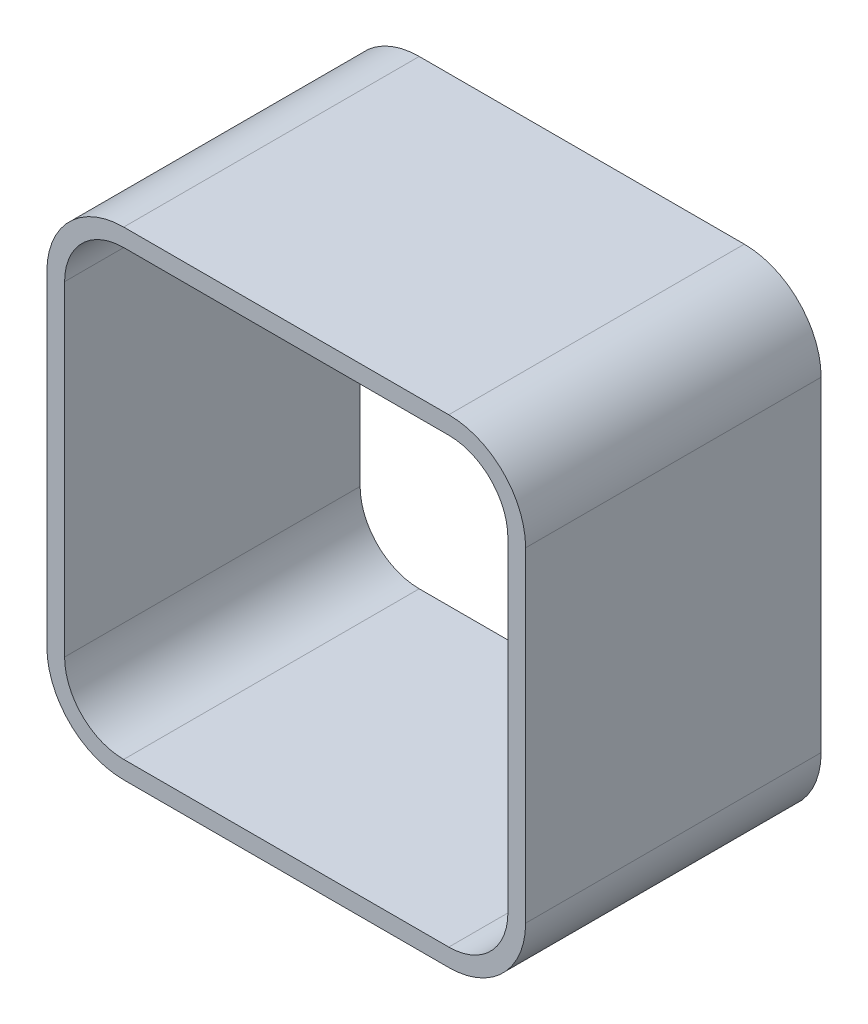
ISO-10303-21;
HEADER;
FILE_DESCRIPTION(('STEP AP214'),'2;1');
FILE_NAME('part.step','',(''),(''),'','','');
FILE_SCHEMA(('AUTOMOTIVE_DESIGN { 1 0 10303 214 1 1 1 1 }'));
ENDSEC;
DATA;
#1=APPLICATION_CONTEXT('core data for automotive mechanical design processes');
#2=APPLICATION_PROTOCOL_DEFINITION('international standard','automotive_design',2000,#1);
#3=PRODUCT_CONTEXT('',#1,'mechanical');
#4=PRODUCT('Part','Part','',(#3));
#5=PRODUCT_RELATED_PRODUCT_CATEGORY('part','',(#4));
#6=PRODUCT_DEFINITION_FORMATION('','',#4);
#7=PRODUCT_DEFINITION_CONTEXT('part definition',#1,'design');
#8=PRODUCT_DEFINITION('design','',#6,#7);
#9=PRODUCT_DEFINITION_SHAPE('','',#8);
#10=(LENGTH_UNIT() NAMED_UNIT(*) SI_UNIT(.MILLI.,.METRE.));
#11=(NAMED_UNIT(*) PLANE_ANGLE_UNIT() SI_UNIT($,.RADIAN.));
#12=(NAMED_UNIT(*) SI_UNIT($,.STERADIAN.) SOLID_ANGLE_UNIT());
#13=UNCERTAINTY_MEASURE_WITH_UNIT(LENGTH_MEASURE(1.E-05),#10,'distance_accuracy_value','');
#14=(GEOMETRIC_REPRESENTATION_CONTEXT(3) GLOBAL_UNCERTAINTY_ASSIGNED_CONTEXT((#13)) GLOBAL_UNIT_ASSIGNED_CONTEXT((#10,
#11,#12)) REPRESENTATION_CONTEXT('',''));
#15=CARTESIAN_POINT('',(0.,0.,0.));
#16=DIRECTION('',(0.,0.,1.));
#17=DIRECTION('',(1.,0.,0.));
#18=AXIS2_PLACEMENT_3D('',#15,#16,#17);
#19=CARTESIAN_POINT('',(0.,0.,10.));
#20=DIRECTION('',(0.,0.,1.));
#21=DIRECTION('',(1.,0.,0.));
#22=AXIS2_PLACEMENT_3D('',#19,#20,#21);
#23=PLANE('',#22);
#24=DIRECTION('',(-1.,0.,0.));
#25=VECTOR('',#24,1.);
#26=CARTESIAN_POINT('',(-8.1,8.1,10.));
#27=LINE('',#26,#25);
#28=CARTESIAN_POINT('',(5.5,8.1,10.));
#29=VERTEX_POINT('',#28);
#30=CARTESIAN_POINT('',(-5.5,8.1,10.));
#31=VERTEX_POINT('',#30);
#32=EDGE_CURVE('E248',#29,#31,#27,.T.);
#33=ORIENTED_EDGE('',*,*,#32,.T.);
#34=CARTESIAN_POINT('',(-5.5,5.5,10.));
#35=DIRECTION('',(0.,0.,1.));
#36=DIRECTION('',(1.,0.,0.));
#37=AXIS2_PLACEMENT_3D('',#34,#35,#36);
#38=CIRCLE('',#37,2.6);
#39=CARTESIAN_POINT('',(-8.1,5.5,10.));
#40=VERTEX_POINT('',#39);
#41=EDGE_CURVE('E230',#31,#40,#38,.T.);
#42=ORIENTED_EDGE('',*,*,#41,.T.);
#43=DIRECTION('',(0.,-1.,0.));
#44=VECTOR('',#43,1.);
#45=CARTESIAN_POINT('',(-8.1,8.1,10.));
#46=LINE('',#45,#44);
#47=CARTESIAN_POINT('',(-8.1,-5.5,10.));
#48=VERTEX_POINT('',#47);
#49=EDGE_CURVE('E176',#40,#48,#46,.T.);
#50=ORIENTED_EDGE('',*,*,#49,.T.);
#51=CARTESIAN_POINT('',(-5.5,-5.5,10.));
#52=DIRECTION('',(0.,0.,1.));
#53=DIRECTION('',(1.,0.,0.));
#54=AXIS2_PLACEMENT_3D('',#51,#52,#53);
#55=CIRCLE('',#54,2.6);
#56=CARTESIAN_POINT('',(-5.5,-8.1,10.));
#57=VERTEX_POINT('',#56);
#58=EDGE_CURVE('E53',#48,#57,#55,.T.);
#59=ORIENTED_EDGE('',*,*,#58,.T.);
#60=DIRECTION('',(1.,0.,0.));
#61=VECTOR('',#60,1.);
#62=CARTESIAN_POINT('',(-8.1,-8.1,10.));
#63=LINE('',#62,#61);
#64=CARTESIAN_POINT('',(5.5,-8.1,10.));
#65=VERTEX_POINT('',#64);
#66=EDGE_CURVE('E172',#57,#65,#63,.T.);
#67=ORIENTED_EDGE('',*,*,#66,.T.);
#68=CARTESIAN_POINT('',(5.5,-5.5,10.));
#69=DIRECTION('',(0.,0.,1.));
#70=DIRECTION('',(1.,0.,0.));
#71=AXIS2_PLACEMENT_3D('',#68,#69,#70);
#72=CIRCLE('',#71,2.6);
#73=CARTESIAN_POINT('',(8.1,-5.5,10.));
#74=VERTEX_POINT('',#73);
#75=EDGE_CURVE('E226',#65,#74,#72,.T.);
#76=ORIENTED_EDGE('',*,*,#75,.T.);
#77=DIRECTION('',(0.,1.,0.));
#78=VECTOR('',#77,1.);
#79=CARTESIAN_POINT('',(8.1,8.1,10.));
#80=LINE('',#79,#78);
#81=CARTESIAN_POINT('',(8.1,5.5,10.));
#82=VERTEX_POINT('',#81);
#83=EDGE_CURVE('E245',#74,#82,#80,.T.);
#84=ORIENTED_EDGE('',*,*,#83,.T.);
#85=CARTESIAN_POINT('',(5.5,5.5,10.));
#86=DIRECTION('',(0.,0.,1.));
#87=DIRECTION('',(1.,0.,0.));
#88=AXIS2_PLACEMENT_3D('',#85,#86,#87);
#89=CIRCLE('',#88,2.6);
#90=EDGE_CURVE('E228',#82,#29,#89,.T.);
#91=ORIENTED_EDGE('',*,*,#90,.T.);
#92=EDGE_LOOP('',(#33,#42,#50,#59,#67,#76,#84,#91));
#93=FACE_BOUND('',#92,.T.);
#94=DIRECTION('',(-1.,0.,0.));
#95=VECTOR('',#94,1.);
#96=CARTESIAN_POINT('',(-7.5,7.5,10.));
#97=LINE('',#96,#95);
#98=CARTESIAN_POINT('',(5.5,7.5,10.));
#99=VERTEX_POINT('',#98);
#100=CARTESIAN_POINT('',(-5.5,7.5,10.));
#101=VERTEX_POINT('',#100);
#102=EDGE_CURVE('E273',#99,#101,#97,.T.);
#103=ORIENTED_EDGE('',*,*,#102,.F.);
#104=CARTESIAN_POINT('',(5.5,5.5,10.));
#105=DIRECTION('',(0.,0.,1.));
#106=DIRECTION('',(1.,0.,0.));
#107=AXIS2_PLACEMENT_3D('',#104,#105,#106);
#108=CIRCLE('',#107,2.);
#109=CARTESIAN_POINT('',(7.5,5.5,10.));
#110=VERTEX_POINT('',#109);
#111=EDGE_CURVE('E158',#99,#110,#108,.F.);
#112=ORIENTED_EDGE('',*,*,#111,.T.);
#113=DIRECTION('',(0.,1.,0.));
#114=VECTOR('',#113,1.);
#115=CARTESIAN_POINT('',(7.5,7.5,10.));
#116=LINE('',#115,#114);
#117=CARTESIAN_POINT('',(7.5,-5.5,10.));
#118=VERTEX_POINT('',#117);
#119=EDGE_CURVE('E263',#118,#110,#116,.T.);
#120=ORIENTED_EDGE('',*,*,#119,.F.);
#121=CARTESIAN_POINT('',(5.5,-5.5,10.));
#122=DIRECTION('',(0.,0.,1.));
#123=DIRECTION('',(1.,0.,0.));
#124=AXIS2_PLACEMENT_3D('',#121,#122,#123);
#125=CIRCLE('',#124,2.);
#126=CARTESIAN_POINT('',(5.5,-7.5,10.));
#127=VERTEX_POINT('',#126);
#128=EDGE_CURVE('E201',#118,#127,#125,.F.);
#129=ORIENTED_EDGE('',*,*,#128,.T.);
#130=DIRECTION('',(1.,0.,0.));
#131=VECTOR('',#130,1.);
#132=CARTESIAN_POINT('',(-7.5,-7.5,10.));
#133=LINE('',#132,#131);
#134=CARTESIAN_POINT('',(-5.5,-7.5,10.));
#135=VERTEX_POINT('',#134);
#136=EDGE_CURVE('E258',#135,#127,#133,.T.);
#137=ORIENTED_EDGE('',*,*,#136,.F.);
#138=CARTESIAN_POINT('',(-5.5,-5.5,10.));
#139=DIRECTION('',(0.,0.,1.));
#140=DIRECTION('',(1.,0.,0.));
#141=AXIS2_PLACEMENT_3D('',#138,#139,#140);
#142=CIRCLE('',#141,2.);
#143=CARTESIAN_POINT('',(-7.5,-5.5,10.));
#144=VERTEX_POINT('',#143);
#145=EDGE_CURVE('E197',#135,#144,#142,.F.);
#146=ORIENTED_EDGE('',*,*,#145,.T.);
#147=DIRECTION('',(0.,-1.,0.));
#148=VECTOR('',#147,1.);
#149=CARTESIAN_POINT('',(-7.5,7.5,10.));
#150=LINE('',#149,#148);
#151=CARTESIAN_POINT('',(-7.5,5.5,10.));
#152=VERTEX_POINT('',#151);
#153=EDGE_CURVE('E271',#152,#144,#150,.T.);
#154=ORIENTED_EDGE('',*,*,#153,.F.);
#155=CARTESIAN_POINT('',(-5.5,5.5,10.));
#156=DIRECTION('',(0.,0.,1.));
#157=DIRECTION('',(1.,0.,0.));
#158=AXIS2_PLACEMENT_3D('',#155,#156,#157);
#159=CIRCLE('',#158,2.);
#160=EDGE_CURVE('E157',#152,#101,#159,.F.);
#161=ORIENTED_EDGE('',*,*,#160,.T.);
#162=EDGE_LOOP('',(#103,#112,#120,#129,#137,#146,#154,#161));
#163=FACE_BOUND('',#162,.T.);
#164=ADVANCED_FACE('F33',(#93,#163),#23,.T.);
#165=CARTESIAN_POINT('',(0.,0.,0.));
#166=DIRECTION('',(0.,0.,1.));
#167=DIRECTION('',(1.,0.,0.));
#168=AXIS2_PLACEMENT_3D('',#165,#166,#167);
#169=PLANE('',#168);
#170=DIRECTION('',(0.,-1.,0.));
#171=VECTOR('',#170,1.);
#172=CARTESIAN_POINT('',(-8.1,8.1,0.));
#173=LINE('',#172,#171);
#174=CARTESIAN_POINT('',(-8.1,5.5,0.));
#175=VERTEX_POINT('',#174);
#176=CARTESIAN_POINT('',(-8.1,-5.5,0.));
#177=VERTEX_POINT('',#176);
#178=EDGE_CURVE('E246',#175,#177,#173,.T.);
#179=ORIENTED_EDGE('',*,*,#178,.F.);
#180=CARTESIAN_POINT('',(-5.5,5.5,0.));
#181=DIRECTION('',(0.,0.,1.));
#182=DIRECTION('',(1.,0.,0.));
#183=AXIS2_PLACEMENT_3D('',#180,#181,#182);
#184=CIRCLE('',#183,2.6);
#185=CARTESIAN_POINT('',(-5.5,8.1,0.));
#186=VERTEX_POINT('',#185);
#187=EDGE_CURVE('E218',#175,#186,#184,.F.);
#188=ORIENTED_EDGE('',*,*,#187,.T.);
#189=DIRECTION('',(-1.,0.,0.));
#190=VECTOR('',#189,1.);
#191=CARTESIAN_POINT('',(-8.1,8.1,0.));
#192=LINE('',#191,#190);
#193=CARTESIAN_POINT('',(5.5,8.1,0.));
#194=VERTEX_POINT('',#193);
#195=EDGE_CURVE('E250',#194,#186,#192,.T.);
#196=ORIENTED_EDGE('',*,*,#195,.F.);
#197=CARTESIAN_POINT('',(5.5,5.5,0.));
#198=DIRECTION('',(0.,0.,1.));
#199=DIRECTION('',(1.,0.,0.));
#200=AXIS2_PLACEMENT_3D('',#197,#198,#199);
#201=CIRCLE('',#200,2.6);
#202=CARTESIAN_POINT('',(8.1,5.5,0.));
#203=VERTEX_POINT('',#202);
#204=EDGE_CURVE('E216',#194,#203,#201,.F.);
#205=ORIENTED_EDGE('',*,*,#204,.T.);
#206=DIRECTION('',(0.,1.,0.));
#207=VECTOR('',#206,1.);
#208=CARTESIAN_POINT('',(8.1,8.1,0.));
#209=LINE('',#208,#207);
#210=CARTESIAN_POINT('',(8.1,-5.5,0.));
#211=VERTEX_POINT('',#210);
#212=EDGE_CURVE('E254',#211,#203,#209,.T.);
#213=ORIENTED_EDGE('',*,*,#212,.F.);
#214=CARTESIAN_POINT('',(5.5,-5.5,0.));
#215=DIRECTION('',(0.,0.,1.));
#216=DIRECTION('',(1.,0.,0.));
#217=AXIS2_PLACEMENT_3D('',#214,#215,#216);
#218=CIRCLE('',#217,2.6);
#219=CARTESIAN_POINT('',(5.5,-8.1,0.));
#220=VERTEX_POINT('',#219);
#221=EDGE_CURVE('E214',#211,#220,#218,.F.);
#222=ORIENTED_EDGE('',*,*,#221,.T.);
#223=DIRECTION('',(1.,0.,0.));
#224=VECTOR('',#223,1.);
#225=CARTESIAN_POINT('',(-8.1,-8.1,0.));
#226=LINE('',#225,#224);
#227=CARTESIAN_POINT('',(-5.5,-8.1,0.));
#228=VERTEX_POINT('',#227);
#229=EDGE_CURVE('E179',#228,#220,#226,.T.);
#230=ORIENTED_EDGE('',*,*,#229,.F.);
#231=CARTESIAN_POINT('',(-5.5,-5.5,0.));
#232=DIRECTION('',(0.,0.,1.));
#233=DIRECTION('',(1.,0.,0.));
#234=AXIS2_PLACEMENT_3D('',#231,#232,#233);
#235=CIRCLE('',#234,2.6);
#236=EDGE_CURVE('E212',#228,#177,#235,.F.);
#237=ORIENTED_EDGE('',*,*,#236,.T.);
#238=EDGE_LOOP('',(#179,#188,#196,#205,#213,#222,#230,#237));
#239=FACE_BOUND('',#238,.T.);
#240=DIRECTION('',(1.,0.,0.));
#241=VECTOR('',#240,1.);
#242=CARTESIAN_POINT('',(-7.5,-7.5,0.));
#243=LINE('',#242,#241);
#244=CARTESIAN_POINT('',(-5.5,-7.5,0.));
#245=VERTEX_POINT('',#244);
#246=CARTESIAN_POINT('',(5.5,-7.5,0.));
#247=VERTEX_POINT('',#246);
#248=EDGE_CURVE('E168',#245,#247,#243,.T.);
#249=ORIENTED_EDGE('',*,*,#248,.T.);
#250=CARTESIAN_POINT('',(5.5,-5.5,0.));
#251=DIRECTION('',(0.,0.,1.));
#252=DIRECTION('',(1.,0.,0.));
#253=AXIS2_PLACEMENT_3D('',#250,#251,#252);
#254=CIRCLE('',#253,2.);
#255=CARTESIAN_POINT('',(7.5,-5.5,0.));
#256=VERTEX_POINT('',#255);
#257=EDGE_CURVE('E199',#247,#256,#254,.T.);
#258=ORIENTED_EDGE('',*,*,#257,.T.);
#259=DIRECTION('',(0.,1.,0.));
#260=VECTOR('',#259,1.);
#261=CARTESIAN_POINT('',(7.5,7.5,0.));
#262=LINE('',#261,#260);
#263=CARTESIAN_POINT('',(7.5,5.5,0.));
#264=VERTEX_POINT('',#263);
#265=EDGE_CURVE('E266',#256,#264,#262,.T.);
#266=ORIENTED_EDGE('',*,*,#265,.T.);
#267=CARTESIAN_POINT('',(5.5,5.5,0.));
#268=DIRECTION('',(0.,0.,1.));
#269=DIRECTION('',(1.,0.,0.));
#270=AXIS2_PLACEMENT_3D('',#267,#268,#269);
#271=CIRCLE('',#270,2.);
#272=CARTESIAN_POINT('',(5.5,7.5,0.));
#273=VERTEX_POINT('',#272);
#274=EDGE_CURVE('E203',#264,#273,#271,.T.);
#275=ORIENTED_EDGE('',*,*,#274,.T.);
#276=DIRECTION('',(-1.,0.,0.));
#277=VECTOR('',#276,1.);
#278=CARTESIAN_POINT('',(-7.5,7.5,0.));
#279=LINE('',#278,#277);
#280=CARTESIAN_POINT('',(-5.5,7.5,0.));
#281=VERTEX_POINT('',#280);
#282=EDGE_CURVE('E152',#273,#281,#279,.T.);
#283=ORIENTED_EDGE('',*,*,#282,.T.);
#284=CARTESIAN_POINT('',(-5.5,5.5,0.));
#285=DIRECTION('',(0.,0.,1.));
#286=DIRECTION('',(1.,0.,0.));
#287=AXIS2_PLACEMENT_3D('',#284,#285,#286);
#288=CIRCLE('',#287,2.);
#289=CARTESIAN_POINT('',(-7.5,5.5,0.));
#290=VERTEX_POINT('',#289);
#291=EDGE_CURVE('E146',#281,#290,#288,.T.);
#292=ORIENTED_EDGE('',*,*,#291,.T.);
#293=DIRECTION('',(0.,-1.,0.));
#294=VECTOR('',#293,1.);
#295=CARTESIAN_POINT('',(-7.5,7.5,0.));
#296=LINE('',#295,#294);
#297=CARTESIAN_POINT('',(-7.5,-5.5,0.));
#298=VERTEX_POINT('',#297);
#299=EDGE_CURVE('E150',#290,#298,#296,.T.);
#300=ORIENTED_EDGE('',*,*,#299,.T.);
#301=CARTESIAN_POINT('',(-5.5,-5.5,0.));
#302=DIRECTION('',(0.,0.,1.));
#303=DIRECTION('',(1.,0.,0.));
#304=AXIS2_PLACEMENT_3D('',#301,#302,#303);
#305=CIRCLE('',#304,2.);
#306=EDGE_CURVE('E195',#298,#245,#305,.T.);
#307=ORIENTED_EDGE('',*,*,#306,.T.);
#308=EDGE_LOOP('',(#249,#258,#266,#275,#283,#292,#300,#307));
#309=FACE_BOUND('',#308,.T.);
#310=ADVANCED_FACE('F149',(#239,#309),#169,.F.);
#311=CARTESIAN_POINT('',(8.1,8.1,10.));
#312=DIRECTION('',(-1.,0.,0.));
#313=DIRECTION('',(0.,0.,1.));
#314=AXIS2_PLACEMENT_3D('',#311,#312,#313);
#315=PLANE('',#314);
#316=ORIENTED_EDGE('',*,*,#212,.T.);
#317=DIRECTION('',(0.,0.,-1.));
#318=VECTOR('',#317,1.);
#319=CARTESIAN_POINT('',(8.1,5.5,10.));
#320=LINE('',#319,#318);
#321=EDGE_CURVE('E235',#203,#82,#320,.F.);
#322=ORIENTED_EDGE('',*,*,#321,.T.);
#323=ORIENTED_EDGE('',*,*,#83,.F.);
#324=DIRECTION('',(0.,0.,-1.));
#325=VECTOR('',#324,1.);
#326=CARTESIAN_POINT('',(8.1,-5.5,10.));
#327=LINE('',#326,#325);
#328=EDGE_CURVE('E232',#74,#211,#327,.T.);
#329=ORIENTED_EDGE('',*,*,#328,.T.);
#330=EDGE_LOOP('',(#316,#322,#323,#329));
#331=FACE_BOUND('',#330,.T.);
#332=ADVANCED_FACE('F316',(#331),#315,.F.);
#333=CARTESIAN_POINT('',(-8.1,8.1,10.));
#334=DIRECTION('',(0.,-1.,0.));
#335=DIRECTION('',(0.,0.,-1.));
#336=AXIS2_PLACEMENT_3D('',#333,#334,#335);
#337=PLANE('',#336);
#338=ORIENTED_EDGE('',*,*,#195,.T.);
#339=DIRECTION('',(0.,0.,-1.));
#340=VECTOR('',#339,1.);
#341=CARTESIAN_POINT('',(-5.5,8.1,10.));
#342=LINE('',#341,#340);
#343=EDGE_CURVE('E223',#186,#31,#342,.F.);
#344=ORIENTED_EDGE('',*,*,#343,.T.);
#345=ORIENTED_EDGE('',*,*,#32,.F.);
#346=DIRECTION('',(0.,0.,-1.));
#347=VECTOR('',#346,1.);
#348=CARTESIAN_POINT('',(5.5,8.1,10.));
#349=LINE('',#348,#347);
#350=EDGE_CURVE('E220',#29,#194,#349,.T.);
#351=ORIENTED_EDGE('',*,*,#350,.T.);
#352=EDGE_LOOP('',(#338,#344,#345,#351));
#353=FACE_BOUND('',#352,.T.);
#354=ADVANCED_FACE('F326',(#353),#337,.F.);
#355=CARTESIAN_POINT('',(-8.1,8.1,10.));
#356=DIRECTION('',(1.,0.,0.));
#357=DIRECTION('',(0.,0.,-1.));
#358=AXIS2_PLACEMENT_3D('',#355,#356,#357);
#359=PLANE('',#358);
#360=ORIENTED_EDGE('',*,*,#49,.F.);
#361=DIRECTION('',(0.,0.,-1.));
#362=VECTOR('',#361,1.);
#363=CARTESIAN_POINT('',(-8.1,5.5,10.));
#364=LINE('',#363,#362);
#365=EDGE_CURVE('E209',#40,#175,#364,.T.);
#366=ORIENTED_EDGE('',*,*,#365,.T.);
#367=ORIENTED_EDGE('',*,*,#178,.T.);
#368=DIRECTION('',(0.,0.,-1.));
#369=VECTOR('',#368,1.);
#370=CARTESIAN_POINT('',(-8.1,-5.5,10.));
#371=LINE('',#370,#369);
#372=EDGE_CURVE('E207',#177,#48,#371,.F.);
#373=ORIENTED_EDGE('',*,*,#372,.T.);
#374=EDGE_LOOP('',(#360,#366,#367,#373));
#375=FACE_BOUND('',#374,.T.);
#376=ADVANCED_FACE('F323',(#375),#359,.F.);
#377=CARTESIAN_POINT('',(-8.1,-8.1,10.));
#378=DIRECTION('',(0.,1.,0.));
#379=DIRECTION('',(0.,0.,1.));
#380=AXIS2_PLACEMENT_3D('',#377,#378,#379);
#381=PLANE('',#380);
#382=ORIENTED_EDGE('',*,*,#229,.T.);
#383=DIRECTION('',(0.,0.,-1.));
#384=VECTOR('',#383,1.);
#385=CARTESIAN_POINT('',(5.5,-8.1,10.));
#386=LINE('',#385,#384);
#387=EDGE_CURVE('E11',#220,#65,#386,.F.);
#388=ORIENTED_EDGE('',*,*,#387,.T.);
#389=ORIENTED_EDGE('',*,*,#66,.F.);
#390=DIRECTION('',(0.,0.,-1.));
#391=VECTOR('',#390,1.);
#392=CARTESIAN_POINT('',(-5.5,-8.1,10.));
#393=LINE('',#392,#391);
#394=EDGE_CURVE('E41',#57,#228,#393,.T.);
#395=ORIENTED_EDGE('',*,*,#394,.T.);
#396=EDGE_LOOP('',(#382,#388,#389,#395));
#397=FACE_BOUND('',#396,.T.);
#398=ADVANCED_FACE('F239',(#397),#381,.F.);
#399=CARTESIAN_POINT('',(7.5,7.5,10.));
#400=DIRECTION('',(-1.,0.,0.));
#401=DIRECTION('',(0.,0.,1.));
#402=AXIS2_PLACEMENT_3D('',#399,#400,#401);
#403=PLANE('',#402);
#404=ORIENTED_EDGE('',*,*,#265,.F.);
#405=DIRECTION('',(0.,0.,-1.));
#406=VECTOR('',#405,1.);
#407=CARTESIAN_POINT('',(7.5,-5.5,10.));
#408=LINE('',#407,#406);
#409=EDGE_CURVE('E189',#256,#118,#408,.F.);
#410=ORIENTED_EDGE('',*,*,#409,.T.);
#411=ORIENTED_EDGE('',*,*,#119,.T.);
#412=DIRECTION('',(0.,0.,-1.));
#413=VECTOR('',#412,1.);
#414=CARTESIAN_POINT('',(7.5,5.5,0.));
#415=LINE('',#414,#413);
#416=EDGE_CURVE('E186',#110,#264,#415,.T.);
#417=ORIENTED_EDGE('',*,*,#416,.T.);
#418=EDGE_LOOP('',(#404,#410,#411,#417));
#419=FACE_BOUND('',#418,.T.);
#420=ADVANCED_FACE('F281',(#419),#403,.T.);
#421=CARTESIAN_POINT('',(-7.5,7.5,10.));
#422=DIRECTION('',(0.,-1.,0.));
#423=DIRECTION('',(0.,0.,-1.));
#424=AXIS2_PLACEMENT_3D('',#421,#422,#423);
#425=PLANE('',#424);
#426=ORIENTED_EDGE('',*,*,#282,.F.);
#427=DIRECTION('',(0.,0.,-1.));
#428=VECTOR('',#427,1.);
#429=CARTESIAN_POINT('',(5.5,7.5,10.));
#430=LINE('',#429,#428);
#431=EDGE_CURVE('E193',#273,#99,#430,.F.);
#432=ORIENTED_EDGE('',*,*,#431,.T.);
#433=ORIENTED_EDGE('',*,*,#102,.T.);
#434=DIRECTION('',(0.,0.,-1.));
#435=VECTOR('',#434,1.);
#436=CARTESIAN_POINT('',(-5.5,7.5,0.));
#437=LINE('',#436,#435);
#438=EDGE_CURVE('E191',#101,#281,#437,.T.);
#439=ORIENTED_EDGE('',*,*,#438,.T.);
#440=EDGE_LOOP('',(#426,#432,#433,#439));
#441=FACE_BOUND('',#440,.T.);
#442=ADVANCED_FACE('F290',(#441),#425,.T.);
#443=CARTESIAN_POINT('',(-7.5,7.5,10.));
#444=DIRECTION('',(1.,0.,0.));
#445=DIRECTION('',(0.,0.,-1.));
#446=AXIS2_PLACEMENT_3D('',#443,#444,#445);
#447=PLANE('',#446);
#448=ORIENTED_EDGE('',*,*,#153,.T.);
#449=DIRECTION('',(0.,0.,-1.));
#450=VECTOR('',#449,1.);
#451=CARTESIAN_POINT('',(-7.5,-5.5,0.));
#452=LINE('',#451,#450);
#453=EDGE_CURVE('E167',#144,#298,#452,.T.);
#454=ORIENTED_EDGE('',*,*,#453,.T.);
#455=ORIENTED_EDGE('',*,*,#299,.F.);
#456=DIRECTION('',(0.,0.,-1.));
#457=VECTOR('',#456,1.);
#458=CARTESIAN_POINT('',(-7.5,5.5,10.));
#459=LINE('',#458,#457);
#460=EDGE_CURVE('E164',#290,#152,#459,.F.);
#461=ORIENTED_EDGE('',*,*,#460,.T.);
#462=EDGE_LOOP('',(#448,#454,#455,#461));
#463=FACE_BOUND('',#462,.T.);
#464=ADVANCED_FACE('F163',(#463),#447,.T.);
#465=CARTESIAN_POINT('',(-7.5,-7.5,10.));
#466=DIRECTION('',(0.,1.,0.));
#467=DIRECTION('',(0.,0.,1.));
#468=AXIS2_PLACEMENT_3D('',#465,#466,#467);
#469=PLANE('',#468);
#470=ORIENTED_EDGE('',*,*,#248,.F.);
#471=DIRECTION('',(0.,0.,-1.));
#472=VECTOR('',#471,1.);
#473=CARTESIAN_POINT('',(-5.5,-7.5,10.));
#474=LINE('',#473,#472);
#475=EDGE_CURVE('E184',#245,#135,#474,.F.);
#476=ORIENTED_EDGE('',*,*,#475,.T.);
#477=ORIENTED_EDGE('',*,*,#136,.T.);
#478=DIRECTION('',(0.,0.,-1.));
#479=VECTOR('',#478,1.);
#480=CARTESIAN_POINT('',(5.5,-7.5,0.));
#481=LINE('',#480,#479);
#482=EDGE_CURVE('E174',#127,#247,#481,.T.);
#483=ORIENTED_EDGE('',*,*,#482,.T.);
#484=EDGE_LOOP('',(#470,#476,#477,#483));
#485=FACE_BOUND('',#484,.T.);
#486=ADVANCED_FACE('F299',(#485),#469,.T.);
#487=CARTESIAN_POINT('',(-5.5,-5.5,10.));
#488=DIRECTION('',(0.,0.,1.));
#489=DIRECTION('',(1.,0.,0.));
#490=AXIS2_PLACEMENT_3D('',#487,#488,#489);
#491=CYLINDRICAL_SURFACE('',#490,2.);
#492=ORIENTED_EDGE('',*,*,#145,.F.);
#493=ORIENTED_EDGE('',*,*,#475,.F.);
#494=ORIENTED_EDGE('',*,*,#306,.F.);
#495=ORIENTED_EDGE('',*,*,#453,.F.);
#496=EDGE_LOOP('',(#492,#493,#494,#495));
#497=FACE_BOUND('',#496,.T.);
#498=ADVANCED_FACE('F295',(#497),#491,.F.);
#499=CARTESIAN_POINT('',(5.5,-5.5,10.));
#500=DIRECTION('',(0.,0.,1.));
#501=DIRECTION('',(1.,0.,0.));
#502=AXIS2_PLACEMENT_3D('',#499,#500,#501);
#503=CYLINDRICAL_SURFACE('',#502,2.);
#504=ORIENTED_EDGE('',*,*,#128,.F.);
#505=ORIENTED_EDGE('',*,*,#409,.F.);
#506=ORIENTED_EDGE('',*,*,#257,.F.);
#507=ORIENTED_EDGE('',*,*,#482,.F.);
#508=EDGE_LOOP('',(#504,#505,#506,#507));
#509=FACE_BOUND('',#508,.T.);
#510=ADVANCED_FACE('F302',(#509),#503,.F.);
#511=CARTESIAN_POINT('',(5.5,5.5,10.));
#512=DIRECTION('',(0.,0.,1.));
#513=DIRECTION('',(1.,0.,0.));
#514=AXIS2_PLACEMENT_3D('',#511,#512,#513);
#515=CYLINDRICAL_SURFACE('',#514,2.);
#516=ORIENTED_EDGE('',*,*,#111,.F.);
#517=ORIENTED_EDGE('',*,*,#431,.F.);
#518=ORIENTED_EDGE('',*,*,#274,.F.);
#519=ORIENTED_EDGE('',*,*,#416,.F.);
#520=EDGE_LOOP('',(#516,#517,#518,#519));
#521=FACE_BOUND('',#520,.T.);
#522=ADVANCED_FACE('F287',(#521),#515,.F.);
#523=CARTESIAN_POINT('',(-5.5,5.5,10.));
#524=DIRECTION('',(0.,0.,1.));
#525=DIRECTION('',(1.,0.,0.));
#526=AXIS2_PLACEMENT_3D('',#523,#524,#525);
#527=CYLINDRICAL_SURFACE('',#526,2.);
#528=ORIENTED_EDGE('',*,*,#160,.F.);
#529=ORIENTED_EDGE('',*,*,#460,.F.);
#530=ORIENTED_EDGE('',*,*,#291,.F.);
#531=ORIENTED_EDGE('',*,*,#438,.F.);
#532=EDGE_LOOP('',(#528,#529,#530,#531));
#533=FACE_BOUND('',#532,.T.);
#534=ADVANCED_FACE('F171',(#533),#527,.F.);
#535=CARTESIAN_POINT('',(-5.5,5.5,10.));
#536=DIRECTION('',(0.,0.,-1.));
#537=DIRECTION('',(-1.,0.,0.));
#538=AXIS2_PLACEMENT_3D('',#535,#536,#537);
#539=CYLINDRICAL_SURFACE('',#538,2.6);
#540=ORIENTED_EDGE('',*,*,#41,.F.);
#541=ORIENTED_EDGE('',*,*,#343,.F.);
#542=ORIENTED_EDGE('',*,*,#187,.F.);
#543=ORIENTED_EDGE('',*,*,#365,.F.);
#544=EDGE_LOOP('',(#540,#541,#542,#543));
#545=FACE_BOUND('',#544,.T.);
#546=ADVANCED_FACE('F346',(#545),#539,.T.);
#547=CARTESIAN_POINT('',(5.5,5.5,10.));
#548=DIRECTION('',(0.,0.,-1.));
#549=DIRECTION('',(-1.,0.,0.));
#550=AXIS2_PLACEMENT_3D('',#547,#548,#549);
#551=CYLINDRICAL_SURFACE('',#550,2.6);
#552=ORIENTED_EDGE('',*,*,#90,.F.);
#553=ORIENTED_EDGE('',*,*,#321,.F.);
#554=ORIENTED_EDGE('',*,*,#204,.F.);
#555=ORIENTED_EDGE('',*,*,#350,.F.);
#556=EDGE_LOOP('',(#552,#553,#554,#555));
#557=FACE_BOUND('',#556,.T.);
#558=ADVANCED_FACE('F339',(#557),#551,.T.);
#559=CARTESIAN_POINT('',(5.5,-5.5,10.));
#560=DIRECTION('',(0.,0.,-1.));
#561=DIRECTION('',(-1.,0.,0.));
#562=AXIS2_PLACEMENT_3D('',#559,#560,#561);
#563=CYLINDRICAL_SURFACE('',#562,2.6);
#564=ORIENTED_EDGE('',*,*,#75,.F.);
#565=ORIENTED_EDGE('',*,*,#387,.F.);
#566=ORIENTED_EDGE('',*,*,#221,.F.);
#567=ORIENTED_EDGE('',*,*,#328,.F.);
#568=EDGE_LOOP('',(#564,#565,#566,#567));
#569=FACE_BOUND('',#568,.T.);
#570=ADVANCED_FACE('F350',(#569),#563,.T.);
#571=CARTESIAN_POINT('',(-5.5,-5.5,10.));
#572=DIRECTION('',(0.,0.,-1.));
#573=DIRECTION('',(-1.,0.,0.));
#574=AXIS2_PLACEMENT_3D('',#571,#572,#573);
#575=CYLINDRICAL_SURFACE('',#574,2.6);
#576=ORIENTED_EDGE('',*,*,#58,.F.);
#577=ORIENTED_EDGE('',*,*,#372,.F.);
#578=ORIENTED_EDGE('',*,*,#236,.F.);
#579=ORIENTED_EDGE('',*,*,#394,.F.);
#580=EDGE_LOOP('',(#576,#577,#578,#579));
#581=FACE_BOUND('',#580,.T.);
#582=ADVANCED_FACE('F35',(#581),#575,.T.);
#583=CLOSED_SHELL('',(#164,#310,#332,#354,#376,#398,#420,#442,#464,#486,#498,#510,#522,#534,
#546,#558,#570,#582));
#584=MANIFOLD_SOLID_BREP('B2',#583);
#585=ADVANCED_BREP_SHAPE_REPRESENTATION('',(#18,#584),#14);
#586=SHAPE_DEFINITION_REPRESENTATION(#9,#585);
ENDSEC;
END-ISO-10303-21;
